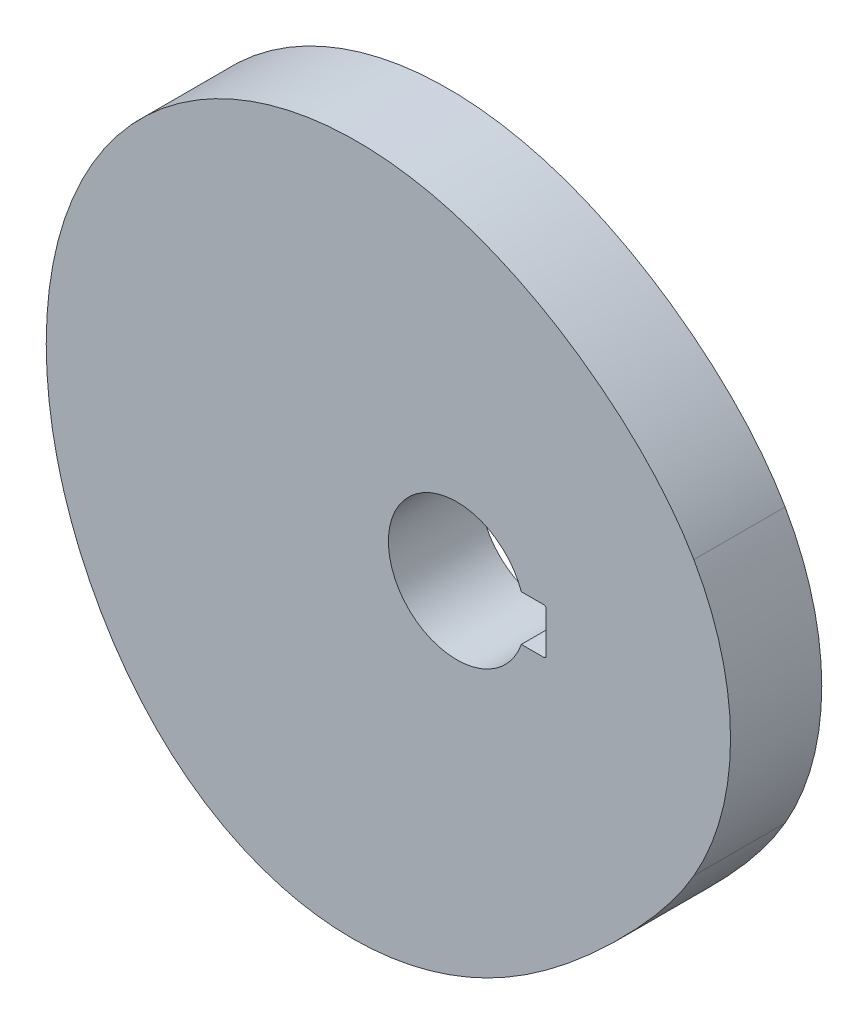
ISO-10303-21;
HEADER;
FILE_DESCRIPTION(('STEP AP214'),'2;1');
FILE_NAME('part.step','',(''),(''),'','','');
FILE_SCHEMA(('AUTOMOTIVE_DESIGN { 1 0 10303 214 1 1 1 1 }'));
ENDSEC;
DATA;
#1=APPLICATION_CONTEXT('core data for automotive mechanical design processes');
#2=APPLICATION_PROTOCOL_DEFINITION('international standard','automotive_design',2000,#1);
#3=PRODUCT_CONTEXT('',#1,'mechanical');
#4=PRODUCT('Part','Part','',(#3));
#5=PRODUCT_RELATED_PRODUCT_CATEGORY('part','',(#4));
#6=PRODUCT_DEFINITION_FORMATION('','',#4);
#7=PRODUCT_DEFINITION_CONTEXT('part definition',#1,'design');
#8=PRODUCT_DEFINITION('design','',#6,#7);
#9=PRODUCT_DEFINITION_SHAPE('','',#8);
#10=(LENGTH_UNIT() NAMED_UNIT(*) SI_UNIT(.MILLI.,.METRE.));
#11=(NAMED_UNIT(*) PLANE_ANGLE_UNIT() SI_UNIT($,.RADIAN.));
#12=(NAMED_UNIT(*) SI_UNIT($,.STERADIAN.) SOLID_ANGLE_UNIT());
#13=UNCERTAINTY_MEASURE_WITH_UNIT(LENGTH_MEASURE(1.E-05),#10,'distance_accuracy_value','');
#14=(GEOMETRIC_REPRESENTATION_CONTEXT(3) GLOBAL_UNCERTAINTY_ASSIGNED_CONTEXT((#13)) GLOBAL_UNIT_ASSIGNED_CONTEXT((#10,
#11,#12)) REPRESENTATION_CONTEXT('',''));
#15=CARTESIAN_POINT('',(0.,0.,0.));
#16=DIRECTION('',(0.,0.,1.));
#17=DIRECTION('',(1.,0.,0.));
#18=AXIS2_PLACEMENT_3D('',#15,#16,#17);
#19=CARTESIAN_POINT('',(-50.,0.,5.));
#20=DIRECTION('',(0.,0.,1.));
#21=DIRECTION('',(1.,0.,0.));
#22=AXIS2_PLACEMENT_3D('',#19,#20,#21);
#23=PLANE('',#22);
#24=CARTESIAN_POINT('',(-50.,0.,5.));
#25=DIRECTION('',(0.,0.,1.));
#26=DIRECTION('',(1.,0.,0.));
#27=AXIS2_PLACEMENT_3D('',#24,#25,#26);
#28=CIRCLE('',#27,30.);
#29=CARTESIAN_POINT('',(-24.0192378864669,-15.0000000000001,5.));
#30=VERTEX_POINT('',#29);
#31=CARTESIAN_POINT('',(-24.0192378866247,15.0000000002734,5.));
#32=VERTEX_POINT('',#31);
#33=EDGE_CURVE('E159',#30,#32,#28,.T.);
#34=ORIENTED_EDGE('',*,*,#33,.T.);
#35=CARTESIAN_POINT('',(-24.0192378866247,15.0000000002734,5.));
#36=CARTESIAN_POINT('',(-24.0683111787963,15.0849974356084,5.));
#37=CARTESIAN_POINT('',(-24.1677817094813,15.2549067052757,5.));
#38=CARTESIAN_POINT('',(-24.3727166139439,15.5992206188409,5.));
#39=CARTESIAN_POINT('',(-24.6186522803278,15.9970959778411,5.));
#40=CARTESIAN_POINT('',(-24.8636551117644,16.3796973626869,5.));
#41=CARTESIAN_POINT('',(-25.1191286865075,16.7670259586303,5.));
#42=CARTESIAN_POINT('',(-25.3797793405813,17.150163728297,5.));
#43=CARTESIAN_POINT('',(-25.6452662113294,17.5287717723048,5.));
#44=CARTESIAN_POINT('',(-25.9456044724153,17.9448521256756,5.));
#45=CARTESIAN_POINT('',(-26.2825226157508,18.3967478505114,5.));
#46=CARTESIAN_POINT('',(-26.6578912658467,18.8827284315202,5.));
#47=CARTESIAN_POINT('',(-27.0737334273974,19.4010980123055,5.));
#48=CARTESIAN_POINT('',(-27.6050527948448,20.0396280283602,5.));
#49=CARTESIAN_POINT('',(-28.2603156584274,20.7908928764337,5.));
#50=CARTESIAN_POINT('',(-29.1374324622823,21.7416608022377,5.));
#51=CARTESIAN_POINT('',(-30.2569365412743,22.8711060336154,5.));
#52=CARTESIAN_POINT('',(-31.5134458820634,24.046837604798,5.));
#53=CARTESIAN_POINT('',(-32.9134504590273,25.2580324738448,5.));
#54=CARTESIAN_POINT('',(-34.7028549205296,26.6936916515159,5.));
#55=CARTESIAN_POINT('',(-36.9167224167216,28.3043170855228,5.));
#56=CARTESIAN_POINT('',(-39.5923180830508,30.0262727925147,5.));
#57=CARTESIAN_POINT('',(-42.7706429784111,31.7701536587237,5.));
#58=CARTESIAN_POINT('',(-46.0704591581779,33.2726724683721,5.));
#59=CARTESIAN_POINT('',(-49.4807436864303,34.5057986195813,5.));
#60=CARTESIAN_POINT('',(-53.1510706562302,35.4848776810059,5.));
#61=CARTESIAN_POINT('',(-56.9010569145065,36.1018903402297,5.));
#62=CARTESIAN_POINT('',(-60.6955031339855,36.3288534653697,5.));
#63=CARTESIAN_POINT('',(-64.4914897821824,36.1456778986248,5.));
#64=CARTESIAN_POINT('',(-68.0780810841253,35.5924429033956,5.));
#65=CARTESIAN_POINT('',(-71.5849963549722,34.6579286486702,5.));
#66=CARTESIAN_POINT('',(-74.9693248523745,33.3466174009843,5.));
#67=CARTESIAN_POINT('',(-78.1887014213685,31.6704275029255,5.));
#68=CARTESIAN_POINT('',(-81.216628818709,29.6392476849812,5.));
#69=CARTESIAN_POINT('',(-84.012954658782,27.2737625926885,5.));
#70=CARTESIAN_POINT('',(-86.2239552899403,24.936788464106,5.));
#71=CARTESIAN_POINT('',(-88.2202153950024,22.3966294122081,5.));
#72=CARTESIAN_POINT('',(-89.7284200531507,20.074270166694,5.));
#73=CARTESIAN_POINT('',(-90.8451183775263,18.0550403699454,5.));
#74=CARTESIAN_POINT('',(-91.8191166465436,15.964820644436,5.));
#75=CARTESIAN_POINT('',(-92.4856190658089,14.3205246731791,5.));
#76=CARTESIAN_POINT('',(-92.9852547215402,12.8974492599532,5.));
#77=CARTESIAN_POINT('',(-93.3529411312239,11.7109258166383,5.));
#78=CARTESIAN_POINT('',(-93.616328574465,10.7708948011233,5.));
#79=CARTESIAN_POINT('',(-93.8117233067228,10.0146278110399,5.));
#80=CARTESIAN_POINT('',(-94.0369085895483,9.06487548051809,5.));
#81=CARTESIAN_POINT('',(-94.2440355368742,8.07431070310892,5.));
#82=CARTESIAN_POINT('',(-94.4303066751601,7.04476506571441,5.));
#83=CARTESIAN_POINT('',(-94.5929274166028,5.97401113376893,5.));
#84=CARTESIAN_POINT('',(-94.710991164961,5.0612039599549,5.));
#85=CARTESIAN_POINT('',(-94.8087565121536,4.14119888922031,5.));
#86=CARTESIAN_POINT('',(-94.8864517710724,3.22807489516539,5.));
#87=CARTESIAN_POINT('',(-94.9443189656429,2.29766879484515,5.));
#88=CARTESIAN_POINT('',(-94.9778257993877,1.50661013401047,5.));
#89=CARTESIAN_POINT('',(-94.9944783690443,0.807430389307903,5.));
#90=CARTESIAN_POINT('',(-94.9992128855272,0.295654948560376,5.));
#91=CARTESIAN_POINT('',(-95.0000000000947,0.0977871003481721,5.));
#92=CARTESIAN_POINT('',(-95.0000000000958,4.74004202140251E-10,5.));
#93=B_SPLINE_CURVE_WITH_KNOTS('',4,(#35,#36,#37,#38,#39,#40,#41,#42,#43,#44,#45,#46,#47,#48,#49,
#50,#51,#52,#53,#54,#55,#56,#57,#58,#59,#60,#61,#62,#63,#64,#65,#66,#67,#68,#69,#70,#71,#72,#73,
#74,#75,#76,#77,#78,#79,#80,#81,#82,#83,#84,#85,#86,#87,#88,#89,#90,#91,#92),.UNSPECIFIED.,.F.,
.F.,(5,1,1,1,1,1,1,1,1,1,1,1,1,1,1,1,1,1,1,1,1,1,1,1,1,1,1,1,1,1,1,1,1,1,1,1,1,1,1,1,1,1,1,1,1,
1,1,1,1,1,1,1,1,1,5),(0.0666737009477039,0.0706042458361506,0.0745347907245972,
0.0784653356130439,0.0823958805014905,0.0863264253899372,0.0902569702783839,0.0941875151668305,
0.0981180600552772,0.103762991127497,0.109407922199716,0.115052853271935,0.120697784344155,
0.131987646488594,0.143277508633032,0.158999688126708,0.174721867620384,0.19044404711406,
0.206166226607735,0.236936318905969,0.267706411204202,0.298476508619686,0.32924660603517,
0.360016732603866,0.390786859172563,0.427383219138807,0.458153279597086,0.488923469510943,
0.519693605787395,0.550463753809893,0.581233828985862,0.612004014166785,0.642774165065364,
0.674103327437637,0.705432524908931,0.721097132059161,0.75242634334333,0.768090947477268,
0.783755546742469,0.799420146007671,0.812688560136472,0.819322767200873,0.825956974265274,
0.832591181329675,0.839225388394075,0.852493802522877,0.860326099257597,0.868158395992317,
0.875990692727038,0.883822989461758,0.891655286196478,0.899487582931198,0.907319879665919,
0.911236028033279,0.915152176400639),.UNSPECIFIED.);
#94=CARTESIAN_POINT('',(-95.0000000000958,4.74004202140251E-10,5.));
#95=VERTEX_POINT('',#94);
#96=EDGE_CURVE('E163',#32,#95,#93,.T.);
#97=ORIENTED_EDGE('',*,*,#96,.T.);
#98=CARTESIAN_POINT('',(-50.,0.,5.));
#99=DIRECTION('',(0.,0.,1.));
#100=DIRECTION('',(1.,0.,0.));
#101=AXIS2_PLACEMENT_3D('',#98,#99,#100);
#102=CIRCLE('',#101,45.);
#103=CARTESIAN_POINT('',(-88.9711431702999,-22.4999999999998,5.));
#104=VERTEX_POINT('',#103);
#105=EDGE_CURVE('E170',#95,#104,#102,.T.);
#106=ORIENTED_EDGE('',*,*,#105,.T.);
#107=CARTESIAN_POINT('',(-24.0192378864669,-15.0000000000001,5.));
#108=CARTESIAN_POINT('',(-24.0577269956042,-15.0666650925639,5.));
#109=CARTESIAN_POINT('',(-24.1355426026772,-15.199984178844,5.));
#110=CARTESIAN_POINT('',(-24.2942102448531,-15.4682848044513,5.));
#111=CARTESIAN_POINT('',(-24.4863677939919,-15.7839921605495,5.));
#112=CARTESIAN_POINT('',(-24.6750509681908,-16.0854849443358,5.));
#113=CARTESIAN_POINT('',(-24.8709033995937,-16.3914280353006,5.));
#114=CARTESIAN_POINT('',(-25.0700857067535,-16.6954006584961,5.));
#115=CARTESIAN_POINT('',(-25.3719649376283,-17.145687962299,5.));
#116=CARTESIAN_POINT('',(-25.7324016648348,-17.6644209745731,5.));
#117=CARTESIAN_POINT('',(-26.259980120411,-18.393991282748,5.));
#118=CARTESIAN_POINT('',(-26.8604547568327,-19.1804998706294,5.));
#119=CARTESIAN_POINT('',(-27.4206393298277,-19.8833489984494,5.));
#120=CARTESIAN_POINT('',(-28.2242733825611,-20.8536096381222,5.));
#121=CARTESIAN_POINT('',(-28.9324711552052,-21.6713437109677,5.));
#122=CARTESIAN_POINT('',(-29.7785212081398,-22.6113646987539,5.));
#123=CARTESIAN_POINT('',(-30.7687408752397,-23.6672720199939,5.));
#124=CARTESIAN_POINT('',(-31.6516268398813,-24.5794054233455,5.));
#125=CARTESIAN_POINT('',(-32.9357533530858,-25.8599263542167,5.));
#126=CARTESIAN_POINT('',(-34.5116273364531,-27.3608995405816,5.));
#127=CARTESIAN_POINT('',(-36.4010548330774,-29.0574450516858,5.));
#128=CARTESIAN_POINT('',(-38.6380368857802,-30.9066834952558,5.));
#129=CARTESIAN_POINT('',(-40.9626850313463,-32.6450889611804,5.));
#130=CARTESIAN_POINT('',(-43.3830537050003,-34.2483717537766,5.));
#131=CARTESIAN_POINT('',(-45.9590169364075,-35.7233914523211,5.));
#132=CARTESIAN_POINT('',(-48.6380870604366,-37.0033301438874,5.));
#133=CARTESIAN_POINT('',(-51.412600635491,-38.062115796619,5.));
#134=CARTESIAN_POINT('',(-54.268660612742,-38.8760577147109,5.));
#135=CARTESIAN_POINT('',(-57.1225623946655,-39.4208365771965,5.));
#136=CARTESIAN_POINT('',(-60.0149753182415,-39.6988009219697,5.));
#137=CARTESIAN_POINT('',(-62.9209571204828,-39.6987481685402,5.));
#138=CARTESIAN_POINT('',(-65.8131535157739,-39.4143298566057,5.));
#139=CARTESIAN_POINT('',(-68.7335084377034,-38.830455346739,5.));
#140=CARTESIAN_POINT('',(-71.6475774468458,-37.9281082867345,5.));
#141=CARTESIAN_POINT('',(-74.5167607615152,-36.695099337027,5.));
#142=CARTESIAN_POINT('',(-77.3005010661449,-35.1279676738646,5.));
#143=CARTESIAN_POINT('',(-79.5810583451766,-33.5123244256605,5.));
#144=CARTESIAN_POINT('',(-81.4131700866985,-31.9719200336645,5.));
#145=CARTESIAN_POINT('',(-82.7104611331753,-30.7323945458772,5.));
#146=CARTESIAN_POINT('',(-83.5427186880828,-29.8735085898026,5.));
#147=CARTESIAN_POINT('',(-84.2143828270889,-29.1373296671178,5.));
#148=CARTESIAN_POINT('',(-84.7385294924656,-28.5366558464865,5.));
#149=CARTESIAN_POINT('',(-85.2456993588448,-27.9292623287831,5.));
#150=CARTESIAN_POINT('',(-85.7361762943577,-27.3160056049717,5.));
#151=CARTESIAN_POINT('',(-86.3280705790924,-26.5439812403364,5.));
#152=CARTESIAN_POINT('',(-86.8956898965741,-25.761539987022,5.));
#153=CARTESIAN_POINT('',(-87.3885418206295,-25.0439648980389,5.));
#154=CARTESIAN_POINT('',(-87.8121269438645,-24.3976372777752,5.));
#155=CARTESIAN_POINT('',(-88.0727684997172,-23.9889729298493,5.));
#156=CARTESIAN_POINT('',(-88.2774150153095,-23.6617315009044,5.));
#157=CARTESIAN_POINT('',(-88.4754991401295,-23.3389282665966,5.));
#158=CARTESIAN_POINT('',(-88.682364543738,-22.9940671634526,5.));
#159=CARTESIAN_POINT('',(-88.8467405975299,-22.7143640060827,5.));
#160=CARTESIAN_POINT('',(-88.9301067020657,-22.5710772479446,5.));
#161=CARTESIAN_POINT('',(-88.9711431702999,-22.4999999999998,5.));
#162=B_SPLINE_CURVE_WITH_KNOTS('',4,(#107,#108,#109,#110,#111,#112,#113,#114,#115,#116,#117,
#118,#119,#120,#121,#122,#123,#124,#125,#126,#127,#128,#129,#130,#131,#132,#133,#134,#135,#136,
#137,#138,#139,#140,#141,#142,#143,#144,#145,#146,#147,#148,#149,#150,#151,#152,#153,#154,#155,
#156,#157,#158,#159,#160,#161),.UNSPECIFIED.,.F.,.F.,(5,1,1,1,1,1,1,1,1,1,1,1,1,1,1,1,1,1,1,1,1,
1,1,1,1,1,1,1,1,1,1,1,1,1,1,1,1,1,1,1,1,1,1,1,1,1,1,1,1,1,1,5),(0.0661006252363608,
0.069918367820793,0.0737361104052252,0.0775538529896574,0.0813715955740896,0.0851893381585218,
0.089007080742954,0.0928248233273862,0.104210914640458,0.111779263369098,0.126915960826377,
0.134484309555017,0.142052658283657,0.16482484069577,0.172460325650604,0.18773129556027,
0.203002265469937,0.218273235379604,0.24881515839397,0.279357081408335,0.309899022195468,
0.340440962982601,0.37098289962659,0.401524836270579,0.43478795791117,0.465329965860735,
0.49587189643773,0.526413880701379,0.55695582726761,0.587497796179683,0.61803975156865,
0.648581738364668,0.682146994762724,0.715712288876023,0.749277563990653,0.782842858420188,
0.799625498593327,0.816408138766466,0.824799459739594,0.833190780712721,0.841582101685848,
0.849973422658975,0.858114253964462,0.866255085269948,0.88253674788092,0.890677579186407,
0.89474799483915,0.898818410491893,0.902888826144636,0.906959241797379,0.911029657450122,
0.915100073102865),.UNSPECIFIED.);
#163=EDGE_CURVE('E213',#30,#104,#162,.T.);
#164=ORIENTED_EDGE('',*,*,#163,.F.);
#165=EDGE_LOOP('',(#34,#97,#106,#164));
#166=FACE_BOUND('',#165,.T.);
#167=DIRECTION('',(0.,1.,0.));
#168=VECTOR('',#167,1.);
#169=CARTESIAN_POINT('',(-40.2,2.5,5.));
#170=LINE('',#169,#168);
#171=CARTESIAN_POINT('',(-40.2,-2.25,5.));
#172=VERTEX_POINT('',#171);
#173=CARTESIAN_POINT('',(-40.2,2.25,5.));
#174=VERTEX_POINT('',#173);
#175=EDGE_CURVE('E144',#172,#174,#170,.T.);
#176=ORIENTED_EDGE('',*,*,#175,.F.);
#177=CARTESIAN_POINT('',(-40.45,-2.25,5.));
#178=DIRECTION('',(0.,0.,1.));
#179=DIRECTION('',(1.,0.,0.));
#180=AXIS2_PLACEMENT_3D('',#177,#178,#179);
#181=CIRCLE('',#180,0.25);
#182=CARTESIAN_POINT('',(-40.45,-2.5,5.));
#183=VERTEX_POINT('',#182);
#184=EDGE_CURVE('E274',#172,#183,#181,.F.);
#185=ORIENTED_EDGE('',*,*,#184,.T.);
#186=DIRECTION('',(1.,0.,0.));
#187=VECTOR('',#186,1.);
#188=CARTESIAN_POINT('',(-42.9289321881345,-2.5,5.));
#189=LINE('',#188,#187);
#190=CARTESIAN_POINT('',(-42.9289321881345,-2.5,5.));
#191=VERTEX_POINT('',#190);
#192=EDGE_CURVE('E155',#191,#183,#189,.T.);
#193=ORIENTED_EDGE('',*,*,#192,.F.);
#194=CARTESIAN_POINT('',(-50.,0.,5.));
#195=DIRECTION('',(0.,0.,1.));
#196=DIRECTION('',(1.,0.,0.));
#197=AXIS2_PLACEMENT_3D('',#194,#195,#196);
#198=CIRCLE('',#197,7.5);
#199=CARTESIAN_POINT('',(-42.9289321881345,2.5,5.));
#200=VERTEX_POINT('',#199);
#201=EDGE_CURVE('E142',#200,#191,#198,.T.);
#202=ORIENTED_EDGE('',*,*,#201,.F.);
#203=DIRECTION('',(-1.,0.,0.));
#204=VECTOR('',#203,1.);
#205=CARTESIAN_POINT('',(-42.9289321881345,2.5,5.));
#206=LINE('',#205,#204);
#207=CARTESIAN_POINT('',(-40.45,2.5,5.));
#208=VERTEX_POINT('',#207);
#209=EDGE_CURVE('E148',#208,#200,#206,.T.);
#210=ORIENTED_EDGE('',*,*,#209,.F.);
#211=CARTESIAN_POINT('',(-40.45,2.25,5.));
#212=DIRECTION('',(0.,0.,1.));
#213=DIRECTION('',(1.,0.,0.));
#214=AXIS2_PLACEMENT_3D('',#211,#212,#213);
#215=CIRCLE('',#214,0.25);
#216=EDGE_CURVE('E11',#208,#174,#215,.F.);
#217=ORIENTED_EDGE('',*,*,#216,.T.);
#218=EDGE_LOOP('',(#176,#185,#193,#202,#210,#217));
#219=FACE_BOUND('',#218,.T.);
#220=ADVANCED_FACE('F45',(#166,#219),#23,.T.);
#221=CARTESIAN_POINT('',(-50.,0.,-5.));
#222=DIRECTION('',(0.,0.,1.));
#223=DIRECTION('',(1.,0.,0.));
#224=AXIS2_PLACEMENT_3D('',#221,#222,#223);
#225=PLANE('',#224);
#226=CARTESIAN_POINT('',(-50.,0.,-5.));
#227=DIRECTION('',(0.,0.,1.));
#228=DIRECTION('',(1.,0.,0.));
#229=AXIS2_PLACEMENT_3D('',#226,#227,#228);
#230=CIRCLE('',#229,30.);
#231=CARTESIAN_POINT('',(-24.0192378864669,-15.0000000000001,-5.));
#232=VERTEX_POINT('',#231);
#233=CARTESIAN_POINT('',(-24.0192378866247,15.0000000002734,-5.));
#234=VERTEX_POINT('',#233);
#235=EDGE_CURVE('E153',#232,#234,#230,.T.);
#236=ORIENTED_EDGE('',*,*,#235,.F.);
#237=CARTESIAN_POINT('',(-24.0192378864669,-15.0000000000001,-5.));
#238=CARTESIAN_POINT('',(-24.0577269956042,-15.0666650925639,-5.));
#239=CARTESIAN_POINT('',(-24.1355426026772,-15.199984178844,-5.));
#240=CARTESIAN_POINT('',(-24.2942102448531,-15.4682848044513,-5.));
#241=CARTESIAN_POINT('',(-24.4863677939919,-15.7839921605495,-5.));
#242=CARTESIAN_POINT('',(-24.6750509681908,-16.0854849443358,-5.));
#243=CARTESIAN_POINT('',(-24.8709033995937,-16.3914280353006,-5.));
#244=CARTESIAN_POINT('',(-25.0700857067535,-16.6954006584961,-5.));
#245=CARTESIAN_POINT('',(-25.3719649376283,-17.145687962299,-5.));
#246=CARTESIAN_POINT('',(-25.7324016648348,-17.6644209745731,-5.));
#247=CARTESIAN_POINT('',(-26.259980120411,-18.393991282748,-5.));
#248=CARTESIAN_POINT('',(-26.8604547568327,-19.1804998706294,-5.));
#249=CARTESIAN_POINT('',(-27.4206393298277,-19.8833489984494,-5.));
#250=CARTESIAN_POINT('',(-28.2242733825611,-20.8536096381222,-5.));
#251=CARTESIAN_POINT('',(-28.9324711552052,-21.6713437109677,-5.));
#252=CARTESIAN_POINT('',(-29.7785212081398,-22.6113646987539,-5.));
#253=CARTESIAN_POINT('',(-30.7687408752397,-23.6672720199939,-5.));
#254=CARTESIAN_POINT('',(-31.6516268398813,-24.5794054233455,-5.));
#255=CARTESIAN_POINT('',(-32.9357533530858,-25.8599263542167,-5.));
#256=CARTESIAN_POINT('',(-34.5116273364531,-27.3608995405816,-5.));
#257=CARTESIAN_POINT('',(-36.4010548330774,-29.0574450516858,-5.));
#258=CARTESIAN_POINT('',(-38.6380368857802,-30.9066834952558,-5.));
#259=CARTESIAN_POINT('',(-40.9626850313463,-32.6450889611804,-5.));
#260=CARTESIAN_POINT('',(-43.3830537050003,-34.2483717537766,-5.));
#261=CARTESIAN_POINT('',(-45.9590169364075,-35.7233914523211,-5.));
#262=CARTESIAN_POINT('',(-48.6380870604366,-37.0033301438874,-5.));
#263=CARTESIAN_POINT('',(-51.412600635491,-38.062115796619,-5.));
#264=CARTESIAN_POINT('',(-54.268660612742,-38.8760577147109,-5.));
#265=CARTESIAN_POINT('',(-57.1225623946655,-39.4208365771965,-5.));
#266=CARTESIAN_POINT('',(-60.0149753182415,-39.6988009219697,-5.));
#267=CARTESIAN_POINT('',(-62.9209571204828,-39.6987481685402,-5.));
#268=CARTESIAN_POINT('',(-65.8131535157739,-39.4143298566057,-5.));
#269=CARTESIAN_POINT('',(-68.7335084377034,-38.830455346739,-5.));
#270=CARTESIAN_POINT('',(-71.6475774468458,-37.9281082867345,-5.));
#271=CARTESIAN_POINT('',(-74.5167607615152,-36.695099337027,-5.));
#272=CARTESIAN_POINT('',(-77.3005010661449,-35.1279676738646,-5.));
#273=CARTESIAN_POINT('',(-79.5810583451766,-33.5123244256605,-5.));
#274=CARTESIAN_POINT('',(-81.4131700866985,-31.9719200336645,-5.));
#275=CARTESIAN_POINT('',(-82.7104611331753,-30.7323945458772,-5.));
#276=CARTESIAN_POINT('',(-83.5427186880828,-29.8735085898026,-5.));
#277=CARTESIAN_POINT('',(-84.2143828270889,-29.1373296671178,-5.));
#278=CARTESIAN_POINT('',(-84.7385294924656,-28.5366558464865,-5.));
#279=CARTESIAN_POINT('',(-85.2456993588448,-27.9292623287831,-5.));
#280=CARTESIAN_POINT('',(-85.7361762943577,-27.3160056049717,-5.));
#281=CARTESIAN_POINT('',(-86.3280705790924,-26.5439812403364,-5.));
#282=CARTESIAN_POINT('',(-86.8956898965741,-25.761539987022,-5.));
#283=CARTESIAN_POINT('',(-87.3885418206295,-25.0439648980389,-5.));
#284=CARTESIAN_POINT('',(-87.8121269438645,-24.3976372777752,-5.));
#285=CARTESIAN_POINT('',(-88.0727684997172,-23.9889729298493,-5.));
#286=CARTESIAN_POINT('',(-88.2774150153095,-23.6617315009044,-5.));
#287=CARTESIAN_POINT('',(-88.4754991401295,-23.3389282665966,-5.));
#288=CARTESIAN_POINT('',(-88.682364543738,-22.9940671634526,-5.));
#289=CARTESIAN_POINT('',(-88.8467405975299,-22.7143640060827,-5.));
#290=CARTESIAN_POINT('',(-88.9301067020657,-22.5710772479446,-5.));
#291=CARTESIAN_POINT('',(-88.9711431702999,-22.4999999999998,-5.));
#292=B_SPLINE_CURVE_WITH_KNOTS('',4,(#237,#238,#239,#240,#241,#242,#243,#244,#245,#246,#247,
#248,#249,#250,#251,#252,#253,#254,#255,#256,#257,#258,#259,#260,#261,#262,#263,#264,#265,#266,
#267,#268,#269,#270,#271,#272,#273,#274,#275,#276,#277,#278,#279,#280,#281,#282,#283,#284,#285,
#286,#287,#288,#289,#290,#291),.UNSPECIFIED.,.F.,.F.,(5,1,1,1,1,1,1,1,1,1,1,1,1,1,1,1,1,1,1,1,1,
1,1,1,1,1,1,1,1,1,1,1,1,1,1,1,1,1,1,1,1,1,1,1,1,1,1,1,1,1,1,5),(0.0661006252363608,
0.069918367820793,0.0737361104052252,0.0775538529896574,0.0813715955740896,0.0851893381585218,
0.089007080742954,0.0928248233273862,0.104210914640458,0.111779263369098,0.126915960826377,
0.134484309555017,0.142052658283657,0.16482484069577,0.172460325650604,0.18773129556027,
0.203002265469937,0.218273235379604,0.24881515839397,0.279357081408335,0.309899022195468,
0.340440962982601,0.37098289962659,0.401524836270579,0.43478795791117,0.465329965860735,
0.49587189643773,0.526413880701379,0.55695582726761,0.587497796179683,0.61803975156865,
0.648581738364668,0.682146994762724,0.715712288876023,0.749277563990653,0.782842858420188,
0.799625498593327,0.816408138766466,0.824799459739594,0.833190780712721,0.841582101685848,
0.849973422658975,0.858114253964462,0.866255085269948,0.88253674788092,0.890677579186407,
0.89474799483915,0.898818410491893,0.902888826144636,0.906959241797379,0.911029657450122,
0.915100073102865),.UNSPECIFIED.);
#293=CARTESIAN_POINT('',(-88.9711431702999,-22.4999999999998,-5.));
#294=VERTEX_POINT('',#293);
#295=EDGE_CURVE('E164',#232,#294,#292,.T.);
#296=ORIENTED_EDGE('',*,*,#295,.T.);
#297=CARTESIAN_POINT('',(-50.,0.,-5.));
#298=DIRECTION('',(0.,0.,1.));
#299=DIRECTION('',(1.,0.,0.));
#300=AXIS2_PLACEMENT_3D('',#297,#298,#299);
#301=CIRCLE('',#300,45.);
#302=CARTESIAN_POINT('',(-95.0000000000958,4.74004202140251E-10,-5.));
#303=VERTEX_POINT('',#302);
#304=EDGE_CURVE('E232',#303,#294,#301,.T.);
#305=ORIENTED_EDGE('',*,*,#304,.F.);
#306=CARTESIAN_POINT('',(-24.0192378866247,15.0000000002734,-5.));
#307=CARTESIAN_POINT('',(-24.0683111787963,15.0849974356084,-5.));
#308=CARTESIAN_POINT('',(-24.1677817094813,15.2549067052757,-5.));
#309=CARTESIAN_POINT('',(-24.3727166139439,15.5992206188409,-5.));
#310=CARTESIAN_POINT('',(-24.6186522803278,15.9970959778411,-5.));
#311=CARTESIAN_POINT('',(-24.8636551117644,16.3796973626869,-5.));
#312=CARTESIAN_POINT('',(-25.1191286865075,16.7670259586303,-5.));
#313=CARTESIAN_POINT('',(-25.3797793405813,17.150163728297,-5.));
#314=CARTESIAN_POINT('',(-25.6452662113294,17.5287717723048,-5.));
#315=CARTESIAN_POINT('',(-25.9456044724153,17.9448521256756,-5.));
#316=CARTESIAN_POINT('',(-26.2825226157508,18.3967478505114,-5.));
#317=CARTESIAN_POINT('',(-26.6578912658467,18.8827284315202,-5.));
#318=CARTESIAN_POINT('',(-27.0737334273974,19.4010980123055,-5.));
#319=CARTESIAN_POINT('',(-27.6050527948448,20.0396280283602,-5.));
#320=CARTESIAN_POINT('',(-28.2603156584274,20.7908928764337,-5.));
#321=CARTESIAN_POINT('',(-29.1374324622823,21.7416608022377,-5.));
#322=CARTESIAN_POINT('',(-30.2569365412743,22.8711060336154,-5.));
#323=CARTESIAN_POINT('',(-31.5134458820634,24.046837604798,-5.));
#324=CARTESIAN_POINT('',(-32.9134504590273,25.2580324738448,-5.));
#325=CARTESIAN_POINT('',(-34.7028549205296,26.6936916515159,-5.));
#326=CARTESIAN_POINT('',(-36.9167224167216,28.3043170855228,-5.));
#327=CARTESIAN_POINT('',(-39.5923180830508,30.0262727925147,-5.));
#328=CARTESIAN_POINT('',(-42.7706429784111,31.7701536587237,-5.));
#329=CARTESIAN_POINT('',(-46.0704591581779,33.2726724683721,-5.));
#330=CARTESIAN_POINT('',(-49.4807436864303,34.5057986195813,-5.));
#331=CARTESIAN_POINT('',(-53.1510706562302,35.4848776810059,-5.));
#332=CARTESIAN_POINT('',(-56.9010569145065,36.1018903402297,-5.));
#333=CARTESIAN_POINT('',(-60.6955031339855,36.3288534653697,-5.));
#334=CARTESIAN_POINT('',(-64.4914897821824,36.1456778986248,-5.));
#335=CARTESIAN_POINT('',(-68.0780810841253,35.5924429033956,-5.));
#336=CARTESIAN_POINT('',(-71.5849963549722,34.6579286486702,-5.));
#337=CARTESIAN_POINT('',(-74.9693248523745,33.3466174009843,-5.));
#338=CARTESIAN_POINT('',(-78.1887014213685,31.6704275029255,-5.));
#339=CARTESIAN_POINT('',(-81.216628818709,29.6392476849812,-5.));
#340=CARTESIAN_POINT('',(-84.012954658782,27.2737625926885,-5.));
#341=CARTESIAN_POINT('',(-86.2239552899403,24.936788464106,-5.));
#342=CARTESIAN_POINT('',(-88.2202153950024,22.3966294122081,-5.));
#343=CARTESIAN_POINT('',(-89.7284200531507,20.074270166694,-5.));
#344=CARTESIAN_POINT('',(-90.8451183775263,18.0550403699454,-5.));
#345=CARTESIAN_POINT('',(-91.8191166465436,15.964820644436,-5.));
#346=CARTESIAN_POINT('',(-92.4856190658089,14.3205246731791,-5.));
#347=CARTESIAN_POINT('',(-92.9852547215402,12.8974492599532,-5.));
#348=CARTESIAN_POINT('',(-93.3529411312239,11.7109258166383,-5.));
#349=CARTESIAN_POINT('',(-93.616328574465,10.7708948011233,-5.));
#350=CARTESIAN_POINT('',(-93.8117233067228,10.0146278110399,-5.));
#351=CARTESIAN_POINT('',(-94.0369085895483,9.06487548051809,-5.));
#352=CARTESIAN_POINT('',(-94.2440355368742,8.07431070310892,-5.));
#353=CARTESIAN_POINT('',(-94.4303066751601,7.04476506571441,-5.));
#354=CARTESIAN_POINT('',(-94.5929274166028,5.97401113376893,-5.));
#355=CARTESIAN_POINT('',(-94.710991164961,5.0612039599549,-5.));
#356=CARTESIAN_POINT('',(-94.8087565121536,4.14119888922031,-5.));
#357=CARTESIAN_POINT('',(-94.8864517710724,3.22807489516539,-5.));
#358=CARTESIAN_POINT('',(-94.9443189656429,2.29766879484515,-5.));
#359=CARTESIAN_POINT('',(-94.9778257993877,1.50661013401047,-5.));
#360=CARTESIAN_POINT('',(-94.9944783690443,0.807430389307903,-5.));
#361=CARTESIAN_POINT('',(-94.9992128855272,0.295654948560376,-5.));
#362=CARTESIAN_POINT('',(-95.0000000000947,0.0977871003481721,-5.));
#363=CARTESIAN_POINT('',(-95.0000000000958,4.74004202140251E-10,-5.));
#364=B_SPLINE_CURVE_WITH_KNOTS('',4,(#306,#307,#308,#309,#310,#311,#312,#313,#314,#315,#316,
#317,#318,#319,#320,#321,#322,#323,#324,#325,#326,#327,#328,#329,#330,#331,#332,#333,#334,#335,
#336,#337,#338,#339,#340,#341,#342,#343,#344,#345,#346,#347,#348,#349,#350,#351,#352,#353,#354,
#355,#356,#357,#358,#359,#360,#361,#362,#363),.UNSPECIFIED.,.F.,.F.,(5,1,1,1,1,1,1,1,1,1,1,1,1,
1,1,1,1,1,1,1,1,1,1,1,1,1,1,1,1,1,1,1,1,1,1,1,1,1,1,1,1,1,1,1,1,1,1,1,1,1,1,1,1,1,5),
(0.0666737009477039,0.0706042458361506,0.0745347907245972,0.0784653356130439,0.0823958805014905,
0.0863264253899372,0.0902569702783839,0.0941875151668305,0.0981180600552772,0.103762991127497,
0.109407922199716,0.115052853271935,0.120697784344155,0.131987646488594,0.143277508633032,
0.158999688126708,0.174721867620384,0.19044404711406,0.206166226607735,0.236936318905969,
0.267706411204202,0.298476508619686,0.32924660603517,0.360016732603866,0.390786859172563,
0.427383219138807,0.458153279597086,0.488923469510943,0.519693605787395,0.550463753809893,
0.581233828985862,0.612004014166785,0.642774165065364,0.674103327437637,0.705432524908931,
0.721097132059161,0.75242634334333,0.768090947477268,0.783755546742469,0.799420146007671,
0.812688560136472,0.819322767200873,0.825956974265274,0.832591181329675,0.839225388394075,
0.852493802522877,0.860326099257597,0.868158395992317,0.875990692727038,0.883822989461758,
0.891655286196478,0.899487582931198,0.907319879665919,0.911236028033279,0.915152176400639),.UNSPECIFIED.);
#365=EDGE_CURVE('E227',#234,#303,#364,.T.);
#366=ORIENTED_EDGE('',*,*,#365,.F.);
#367=EDGE_LOOP('',(#236,#296,#305,#366));
#368=FACE_BOUND('',#367,.T.);
#369=DIRECTION('',(-1.,0.,0.));
#370=VECTOR('',#369,1.);
#371=CARTESIAN_POINT('',(-42.9289321881345,-2.5,-5.));
#372=LINE('',#371,#370);
#373=CARTESIAN_POINT('',(-40.45,-2.5,-5.));
#374=VERTEX_POINT('',#373);
#375=CARTESIAN_POINT('',(-42.9289321881345,-2.5,-5.));
#376=VERTEX_POINT('',#375);
#377=EDGE_CURVE('E122',#374,#376,#372,.T.);
#378=ORIENTED_EDGE('',*,*,#377,.F.);
#379=CARTESIAN_POINT('',(-40.45,-2.25,-5.));
#380=DIRECTION('',(0.,0.,1.));
#381=DIRECTION('',(1.,0.,0.));
#382=AXIS2_PLACEMENT_3D('',#379,#380,#381);
#383=CIRCLE('',#382,0.25);
#384=CARTESIAN_POINT('',(-40.2,-2.25,-5.));
#385=VERTEX_POINT('',#384);
#386=EDGE_CURVE('E271',#374,#385,#383,.T.);
#387=ORIENTED_EDGE('',*,*,#386,.T.);
#388=DIRECTION('',(0.,-1.,0.));
#389=VECTOR('',#388,1.);
#390=CARTESIAN_POINT('',(-40.2,2.5,-5.));
#391=LINE('',#390,#389);
#392=CARTESIAN_POINT('',(-40.2,2.25,-5.));
#393=VERTEX_POINT('',#392);
#394=EDGE_CURVE('E372',#393,#385,#391,.T.);
#395=ORIENTED_EDGE('',*,*,#394,.F.);
#396=CARTESIAN_POINT('',(-40.45,2.25,-5.));
#397=DIRECTION('',(0.,0.,1.));
#398=DIRECTION('',(1.,0.,0.));
#399=AXIS2_PLACEMENT_3D('',#396,#397,#398);
#400=CIRCLE('',#399,0.25);
#401=CARTESIAN_POINT('',(-40.45,2.5,-5.));
#402=VERTEX_POINT('',#401);
#403=EDGE_CURVE('E54',#393,#402,#400,.T.);
#404=ORIENTED_EDGE('',*,*,#403,.T.);
#405=DIRECTION('',(1.,0.,0.));
#406=VECTOR('',#405,1.);
#407=CARTESIAN_POINT('',(-42.9289321881345,2.5,-5.));
#408=LINE('',#407,#406);
#409=CARTESIAN_POINT('',(-42.9289321881345,2.5,-5.));
#410=VERTEX_POINT('',#409);
#411=EDGE_CURVE('E133',#410,#402,#408,.T.);
#412=ORIENTED_EDGE('',*,*,#411,.F.);
#413=CARTESIAN_POINT('',(-50.,0.,-5.));
#414=DIRECTION('',(0.,0.,1.));
#415=DIRECTION('',(1.,0.,0.));
#416=AXIS2_PLACEMENT_3D('',#413,#414,#415);
#417=CIRCLE('',#416,7.5);
#418=EDGE_CURVE('E140',#376,#410,#417,.F.);
#419=ORIENTED_EDGE('',*,*,#418,.F.);
#420=EDGE_LOOP('',(#378,#387,#395,#404,#412,#419));
#421=FACE_BOUND('',#420,.T.);
#422=ADVANCED_FACE('F146',(#368,#421),#225,.F.);
#423=CARTESIAN_POINT('',(-50.,0.,5.001));
#424=DIRECTION('',(0.,0.,-1.));
#425=DIRECTION('',(-1.,0.,0.));
#426=AXIS2_PLACEMENT_3D('',#423,#424,#425);
#427=CYLINDRICAL_SURFACE('',#426,7.5);
#428=ORIENTED_EDGE('',*,*,#201,.T.);
#429=DIRECTION('',(0.,0.,-1.));
#430=VECTOR('',#429,1.);
#431=CARTESIAN_POINT('',(-42.9289321881345,-2.5,5.001));
#432=LINE('',#431,#430);
#433=EDGE_CURVE('E126',#376,#191,#432,.F.);
#434=ORIENTED_EDGE('',*,*,#433,.F.);
#435=ORIENTED_EDGE('',*,*,#418,.T.);
#436=DIRECTION('',(0.,0.,-1.));
#437=VECTOR('',#436,1.);
#438=CARTESIAN_POINT('',(-42.9289321881345,2.5,5.001));
#439=LINE('',#438,#437);
#440=EDGE_CURVE('E132',#200,#410,#439,.T.);
#441=ORIENTED_EDGE('',*,*,#440,.F.);
#442=EDGE_LOOP('',(#428,#434,#435,#441));
#443=FACE_BOUND('',#442,.T.);
#444=ADVANCED_FACE('F138',(#443),#427,.F.);
#445=CARTESIAN_POINT('',(-50.,0.,5.));
#446=DIRECTION('',(0.,0.,-1.));
#447=DIRECTION('',(-1.,0.,0.));
#448=AXIS2_PLACEMENT_3D('',#445,#446,#447);
#449=CYLINDRICAL_SURFACE('',#448,30.);
#450=ORIENTED_EDGE('',*,*,#235,.T.);
#451=DIRECTION('',(0.,0.,-1.));
#452=VECTOR('',#451,1.);
#453=CARTESIAN_POINT('',(-24.0192378866247,15.0000000002734,5.));
#454=LINE('',#453,#452);
#455=EDGE_CURVE('E256',#32,#234,#454,.T.);
#456=ORIENTED_EDGE('',*,*,#455,.F.);
#457=ORIENTED_EDGE('',*,*,#33,.F.);
#458=DIRECTION('',(0.,0.,-1.));
#459=VECTOR('',#458,1.);
#460=CARTESIAN_POINT('',(-24.0192378864669,-15.0000000000001,5.));
#461=LINE('',#460,#459);
#462=EDGE_CURVE('E220',#30,#232,#461,.T.);
#463=ORIENTED_EDGE('',*,*,#462,.T.);
#464=EDGE_LOOP('',(#450,#456,#457,#463));
#465=FACE_BOUND('',#464,.T.);
#466=ADVANCED_FACE('F181',(#465),#449,.T.);
#467=DIRECTION('',(0.,0.,-1.));
#468=VECTOR('',#467,1.);
#469=SURFACE_OF_LINEAR_EXTRUSION('',#93,#468);
#470=ORIENTED_EDGE('',*,*,#365,.T.);
#471=DIRECTION('',(0.,0.,-1.));
#472=VECTOR('',#471,1.);
#473=CARTESIAN_POINT('',(-95.0000000000958,4.74004202140251E-10,5.));
#474=LINE('',#473,#472);
#475=EDGE_CURVE('E252',#95,#303,#474,.T.);
#476=ORIENTED_EDGE('',*,*,#475,.F.);
#477=ORIENTED_EDGE('',*,*,#96,.F.);
#478=ORIENTED_EDGE('',*,*,#455,.T.);
#479=EDGE_LOOP('',(#470,#476,#477,#478));
#480=FACE_BOUND('',#479,.T.);
#481=ADVANCED_FACE('F176',(#480),#469,.F.);
#482=CARTESIAN_POINT('',(-50.,0.,5.));
#483=DIRECTION('',(0.,0.,-1.));
#484=DIRECTION('',(-1.,0.,0.));
#485=AXIS2_PLACEMENT_3D('',#482,#483,#484);
#486=CYLINDRICAL_SURFACE('',#485,45.);
#487=ORIENTED_EDGE('',*,*,#304,.T.);
#488=DIRECTION('',(0.,0.,-1.));
#489=VECTOR('',#488,1.);
#490=CARTESIAN_POINT('',(-88.9711431702999,-22.4999999999998,5.));
#491=LINE('',#490,#489);
#492=EDGE_CURVE('E249',#104,#294,#491,.T.);
#493=ORIENTED_EDGE('',*,*,#492,.F.);
#494=ORIENTED_EDGE('',*,*,#105,.F.);
#495=ORIENTED_EDGE('',*,*,#475,.T.);
#496=EDGE_LOOP('',(#487,#493,#494,#495));
#497=FACE_BOUND('',#496,.T.);
#498=ADVANCED_FACE('F180',(#497),#486,.T.);
#499=DIRECTION('',(0.,0.,-1.));
#500=VECTOR('',#499,1.);
#501=SURFACE_OF_LINEAR_EXTRUSION('',#162,#500);
#502=ORIENTED_EDGE('',*,*,#295,.F.);
#503=ORIENTED_EDGE('',*,*,#462,.F.);
#504=ORIENTED_EDGE('',*,*,#163,.T.);
#505=ORIENTED_EDGE('',*,*,#492,.T.);
#506=EDGE_LOOP('',(#502,#503,#504,#505));
#507=FACE_BOUND('',#506,.T.);
#508=ADVANCED_FACE('F210',(#507),#501,.T.);
#509=CARTESIAN_POINT('',(-42.9289321881345,-2.5,5.001));
#510=DIRECTION('',(0.,1.,0.));
#511=DIRECTION('',(0.,0.,1.));
#512=AXIS2_PLACEMENT_3D('',#509,#510,#511);
#513=PLANE('',#512);
#514=ORIENTED_EDGE('',*,*,#192,.T.);
#515=DIRECTION('',(0.,0.,-1.));
#516=VECTOR('',#515,1.);
#517=CARTESIAN_POINT('',(-40.45,-2.5,-5.));
#518=LINE('',#517,#516);
#519=EDGE_CURVE('E129',#183,#374,#518,.T.);
#520=ORIENTED_EDGE('',*,*,#519,.T.);
#521=ORIENTED_EDGE('',*,*,#377,.T.);
#522=ORIENTED_EDGE('',*,*,#433,.T.);
#523=EDGE_LOOP('',(#514,#520,#521,#522));
#524=FACE_BOUND('',#523,.T.);
#525=ADVANCED_FACE('F125',(#524),#513,.T.);
#526=CARTESIAN_POINT('',(-40.2,2.5,5.001));
#527=DIRECTION('',(-1.,0.,0.));
#528=DIRECTION('',(0.,0.,1.));
#529=AXIS2_PLACEMENT_3D('',#526,#527,#528);
#530=PLANE('',#529);
#531=ORIENTED_EDGE('',*,*,#394,.T.);
#532=DIRECTION('',(0.,0.,-1.));
#533=VECTOR('',#532,1.);
#534=CARTESIAN_POINT('',(-40.2,-2.25,5.));
#535=LINE('',#534,#533);
#536=EDGE_CURVE('E266',#385,#172,#535,.F.);
#537=ORIENTED_EDGE('',*,*,#536,.T.);
#538=ORIENTED_EDGE('',*,*,#175,.T.);
#539=DIRECTION('',(0.,0.,-1.));
#540=VECTOR('',#539,1.);
#541=CARTESIAN_POINT('',(-40.2,2.25,-5.));
#542=LINE('',#541,#540);
#543=EDGE_CURVE('E262',#174,#393,#542,.T.);
#544=ORIENTED_EDGE('',*,*,#543,.T.);
#545=EDGE_LOOP('',(#531,#537,#538,#544));
#546=FACE_BOUND('',#545,.T.);
#547=ADVANCED_FACE('F195',(#546),#530,.T.);
#548=CARTESIAN_POINT('',(-42.9289321881345,2.5,5.001));
#549=DIRECTION('',(0.,-1.,0.));
#550=DIRECTION('',(0.,0.,-1.));
#551=AXIS2_PLACEMENT_3D('',#548,#549,#550);
#552=PLANE('',#551);
#553=ORIENTED_EDGE('',*,*,#411,.T.);
#554=DIRECTION('',(0.,0.,-1.));
#555=VECTOR('',#554,1.);
#556=CARTESIAN_POINT('',(-40.45,2.5,5.));
#557=LINE('',#556,#555);
#558=EDGE_CURVE('E67',#402,#208,#557,.F.);
#559=ORIENTED_EDGE('',*,*,#558,.T.);
#560=ORIENTED_EDGE('',*,*,#209,.T.);
#561=ORIENTED_EDGE('',*,*,#440,.T.);
#562=EDGE_LOOP('',(#553,#559,#560,#561));
#563=FACE_BOUND('',#562,.T.);
#564=ADVANCED_FACE('F188',(#563),#552,.T.);
#565=CARTESIAN_POINT('',(-40.45,-2.25,5.001));
#566=DIRECTION('',(0.,0.,1.));
#567=DIRECTION('',(1.,0.,0.));
#568=AXIS2_PLACEMENT_3D('',#565,#566,#567);
#569=CYLINDRICAL_SURFACE('',#568,0.25);
#570=ORIENTED_EDGE('',*,*,#184,.F.);
#571=ORIENTED_EDGE('',*,*,#536,.F.);
#572=ORIENTED_EDGE('',*,*,#386,.F.);
#573=ORIENTED_EDGE('',*,*,#519,.F.);
#574=EDGE_LOOP('',(#570,#571,#572,#573));
#575=FACE_BOUND('',#574,.T.);
#576=ADVANCED_FACE('F186',(#575),#569,.F.);
#577=CARTESIAN_POINT('',(-40.45,2.25,5.001));
#578=DIRECTION('',(0.,0.,1.));
#579=DIRECTION('',(1.,0.,0.));
#580=AXIS2_PLACEMENT_3D('',#577,#578,#579);
#581=CYLINDRICAL_SURFACE('',#580,0.25);
#582=ORIENTED_EDGE('',*,*,#216,.F.);
#583=ORIENTED_EDGE('',*,*,#558,.F.);
#584=ORIENTED_EDGE('',*,*,#403,.F.);
#585=ORIENTED_EDGE('',*,*,#543,.F.);
#586=EDGE_LOOP('',(#582,#583,#584,#585));
#587=FACE_BOUND('',#586,.T.);
#588=ADVANCED_FACE('F47',(#587),#581,.F.);
#589=CLOSED_SHELL('',(#220,#422,#444,#466,#481,#498,#508,#525,#547,#564,#576,#588));
#590=MANIFOLD_SOLID_BREP('B2',#589);
#591=ADVANCED_BREP_SHAPE_REPRESENTATION('',(#18,#590),#14);
#592=SHAPE_DEFINITION_REPRESENTATION(#9,#591);
ENDSEC;
END-ISO-10303-21;
